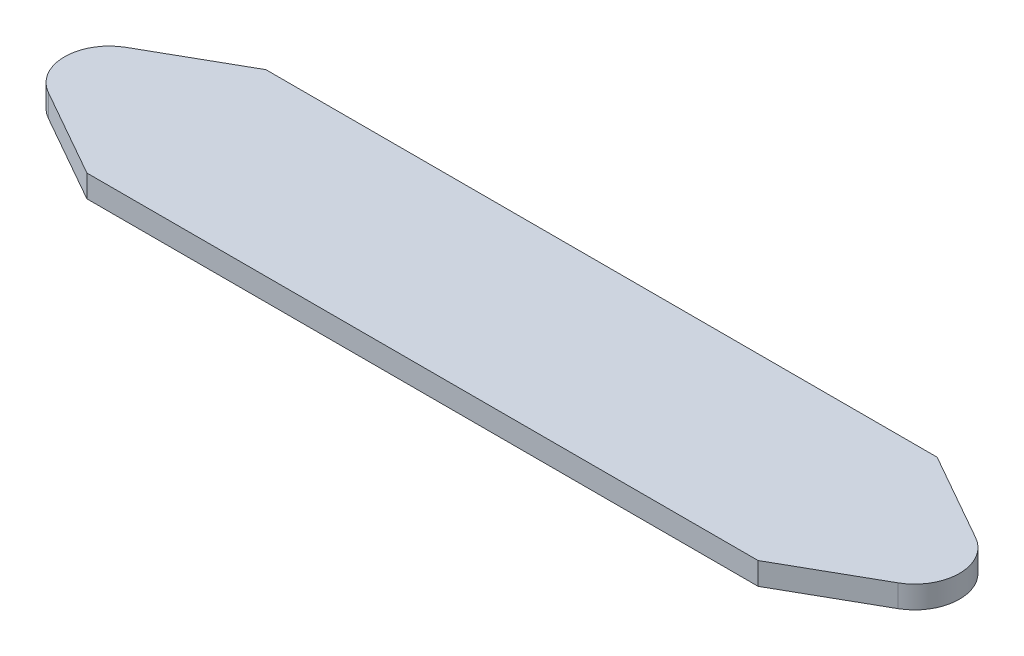
ISO-10303-21;
HEADER;
FILE_DESCRIPTION(('STEP AP214'),'2;1');
FILE_NAME('part.step','',(''),(''),'','','');
FILE_SCHEMA(('AUTOMOTIVE_DESIGN { 1 0 10303 214 1 1 1 1 }'));
ENDSEC;
DATA;
#1=APPLICATION_CONTEXT('core data for automotive mechanical design processes');
#2=APPLICATION_PROTOCOL_DEFINITION('international standard','automotive_design',2000,#1);
#3=PRODUCT_CONTEXT('',#1,'mechanical');
#4=PRODUCT('Part','Part','',(#3));
#5=PRODUCT_RELATED_PRODUCT_CATEGORY('part','',(#4));
#6=PRODUCT_DEFINITION_FORMATION('','',#4);
#7=PRODUCT_DEFINITION_CONTEXT('part definition',#1,'design');
#8=PRODUCT_DEFINITION('design','',#6,#7);
#9=PRODUCT_DEFINITION_SHAPE('','',#8);
#10=(LENGTH_UNIT() NAMED_UNIT(*) SI_UNIT(.MILLI.,.METRE.));
#11=(NAMED_UNIT(*) PLANE_ANGLE_UNIT() SI_UNIT($,.RADIAN.));
#12=(NAMED_UNIT(*) SI_UNIT($,.STERADIAN.) SOLID_ANGLE_UNIT());
#13=UNCERTAINTY_MEASURE_WITH_UNIT(LENGTH_MEASURE(1.E-05),#10,'distance_accuracy_value','');
#14=(GEOMETRIC_REPRESENTATION_CONTEXT(3) GLOBAL_UNCERTAINTY_ASSIGNED_CONTEXT((#13)) GLOBAL_UNIT_ASSIGNED_CONTEXT((#10,
#11,#12)) REPRESENTATION_CONTEXT('',''));
#15=CARTESIAN_POINT('',(0.,0.,0.));
#16=DIRECTION('',(0.,0.,1.));
#17=DIRECTION('',(1.,0.,0.));
#18=AXIS2_PLACEMENT_3D('',#15,#16,#17);
#19=CARTESIAN_POINT('',(180.,9.99999999999998,2.22044604925031E-13));
#20=DIRECTION('',(0.,-0.999999999999999,0.));
#21=DIRECTION('',(0.,0.,-0.999999999999996));
#22=AXIS2_PLACEMENT_3D('',#19,#20,#21);
#23=CYLINDRICAL_SURFACE('',#22,20.);
#24=CARTESIAN_POINT('',(180.,0.,2.22044604925031E-13));
#25=DIRECTION('',(0.,0.999999999999999,0.));
#26=DIRECTION('',(0.,0.,0.999999999999996));
#27=AXIS2_PLACEMENT_3D('',#24,#25,#26);
#28=CIRCLE('',#27,20.);
#29=CARTESIAN_POINT('',(189.864242223859,0.,17.3981816678941));
#30=VERTEX_POINT('',#29);
#31=CARTESIAN_POINT('',(189.864242223859,0.,-17.3981816678937));
#32=VERTEX_POINT('',#31);
#33=EDGE_CURVE('E128',#30,#32,#28,.T.);
#34=ORIENTED_EDGE('',*,*,#33,.T.);
#35=DIRECTION('',(0.,-0.999999999999999,0.));
#36=VECTOR('',#35,1.);
#37=CARTESIAN_POINT('',(189.864242223858,10.,-17.3981816678937));
#38=LINE('',#37,#36);
#39=CARTESIAN_POINT('',(189.864242223858,10.,-17.3981816678937));
#40=VERTEX_POINT('',#39);
#41=EDGE_CURVE('E11',#40,#32,#38,.T.);
#42=ORIENTED_EDGE('',*,*,#41,.F.);
#43=CARTESIAN_POINT('',(180.,9.99999999999998,2.22044604925031E-13));
#44=DIRECTION('',(0.,0.999999999999999,0.));
#45=DIRECTION('',(0.,0.,0.999999999999996));
#46=AXIS2_PLACEMENT_3D('',#43,#44,#45);
#47=CIRCLE('',#46,20.);
#48=CARTESIAN_POINT('',(189.864242223859,10.,17.3981816678941));
#49=VERTEX_POINT('',#48);
#50=EDGE_CURVE('E142',#49,#40,#47,.T.);
#51=ORIENTED_EDGE('',*,*,#50,.F.);
#52=DIRECTION('',(0.,-0.999999999999999,0.));
#53=VECTOR('',#52,1.);
#54=CARTESIAN_POINT('',(189.864242223859,10.,17.3981816678941));
#55=LINE('',#54,#53);
#56=EDGE_CURVE('E124',#49,#30,#55,.T.);
#57=ORIENTED_EDGE('',*,*,#56,.T.);
#58=EDGE_LOOP('',(#34,#42,#51,#57));
#59=FACE_BOUND('',#58,.T.);
#60=ADVANCED_FACE('F32',(#59),#23,.T.);
#61=CARTESIAN_POINT('',(150.,9.99999999999998,-39.9999999999996));
#62=DIRECTION('',(-0.493212111192936,0.,0.869909083394697));
#63=DIRECTION('',(0.869909083394701,0.,0.493212111192932));
#64=AXIS2_PLACEMENT_3D('',#61,#62,#63);
#65=PLANE('',#64);
#66=DIRECTION('',(-0.869909083394701,0.,-0.493212111192931));
#67=VECTOR('',#66,1.);
#68=CARTESIAN_POINT('',(150.,0.,-39.9999999999996));
#69=LINE('',#68,#67);
#70=CARTESIAN_POINT('',(150.,0.,-39.9999999999996));
#71=VERTEX_POINT('',#70);
#72=EDGE_CURVE('E131',#32,#71,#69,.T.);
#73=ORIENTED_EDGE('',*,*,#72,.T.);
#74=DIRECTION('',(0.,-0.999999999999999,0.));
#75=VECTOR('',#74,1.);
#76=CARTESIAN_POINT('',(150.,9.99999999999998,-39.9999999999996));
#77=LINE('',#76,#75);
#78=CARTESIAN_POINT('',(150.,9.99999999999998,-39.9999999999996));
#79=VERTEX_POINT('',#78);
#80=EDGE_CURVE('E40',#79,#71,#77,.T.);
#81=ORIENTED_EDGE('',*,*,#80,.F.);
#82=DIRECTION('',(-0.869909083394701,0.,-0.493212111192931));
#83=VECTOR('',#82,1.);
#84=CARTESIAN_POINT('',(150.,9.99999999999998,-39.9999999999996));
#85=LINE('',#84,#83);
#86=EDGE_CURVE('E91',#40,#79,#85,.T.);
#87=ORIENTED_EDGE('',*,*,#86,.F.);
#88=ORIENTED_EDGE('',*,*,#41,.T.);
#89=EDGE_LOOP('',(#73,#81,#87,#88));
#90=FACE_BOUND('',#89,.T.);
#91=ADVANCED_FACE('F177',(#90),#65,.F.);
#92=CARTESIAN_POINT('',(-150.,9.99999999999995,-39.9999999999993));
#93=DIRECTION('',(0.,0.,0.999999999999996));
#94=DIRECTION('',(1.,0.,0.));
#95=AXIS2_PLACEMENT_3D('',#92,#93,#94);
#96=PLANE('',#95);
#97=DIRECTION('',(-1.,0.,0.));
#98=VECTOR('',#97,1.);
#99=CARTESIAN_POINT('',(-150.,0.,-39.9999999999993));
#100=LINE('',#99,#98);
#101=CARTESIAN_POINT('',(-150.,0.,-39.9999999999993));
#102=VERTEX_POINT('',#101);
#103=EDGE_CURVE('E133',#71,#102,#100,.T.);
#104=ORIENTED_EDGE('',*,*,#103,.T.);
#105=DIRECTION('',(0.,-0.999999999999999,0.));
#106=VECTOR('',#105,1.);
#107=CARTESIAN_POINT('',(-150.,9.99999999999995,-39.9999999999993));
#108=LINE('',#107,#106);
#109=CARTESIAN_POINT('',(-150.,9.99999999999995,-39.9999999999993));
#110=VERTEX_POINT('',#109);
#111=EDGE_CURVE('E149',#110,#102,#108,.T.);
#112=ORIENTED_EDGE('',*,*,#111,.F.);
#113=DIRECTION('',(-1.,0.,0.));
#114=VECTOR('',#113,1.);
#115=CARTESIAN_POINT('',(-150.,9.99999999999995,-39.9999999999993));
#116=LINE('',#115,#114);
#117=EDGE_CURVE('E157',#79,#110,#116,.T.);
#118=ORIENTED_EDGE('',*,*,#117,.F.);
#119=ORIENTED_EDGE('',*,*,#80,.T.);
#120=EDGE_LOOP('',(#104,#112,#118,#119));
#121=FACE_BOUND('',#120,.T.);
#122=ADVANCED_FACE('F155',(#121),#96,.F.);
#123=CARTESIAN_POINT('',(-189.864242223859,9.99999999999993,-17.3981816678934));
#124=DIRECTION('',(0.493212111192934,0.,0.869909083394696));
#125=DIRECTION('',(0.869909083394702,0.,-0.493212111192933));
#126=AXIS2_PLACEMENT_3D('',#123,#124,#125);
#127=PLANE('',#126);
#128=DIRECTION('',(-0.869909083394702,0.,0.493212111192933));
#129=VECTOR('',#128,1.);
#130=CARTESIAN_POINT('',(-189.864242223859,0.,-17.3981816678934));
#131=LINE('',#130,#129);
#132=CARTESIAN_POINT('',(-189.864242223859,0.,-17.3981816678934));
#133=VERTEX_POINT('',#132);
#134=EDGE_CURVE('E135',#102,#133,#131,.T.);
#135=ORIENTED_EDGE('',*,*,#134,.T.);
#136=DIRECTION('',(0.,-0.999999999999999,0.));
#137=VECTOR('',#136,1.);
#138=CARTESIAN_POINT('',(-189.864242223859,9.99999999999993,-17.3981816678934));
#139=LINE('',#138,#137);
#140=CARTESIAN_POINT('',(-189.864242223859,9.99999999999993,-17.3981816678934));
#141=VERTEX_POINT('',#140);
#142=EDGE_CURVE('E146',#141,#133,#139,.T.);
#143=ORIENTED_EDGE('',*,*,#142,.F.);
#144=DIRECTION('',(-0.869909083394702,0.,0.493212111192933));
#145=VECTOR('',#144,1.);
#146=CARTESIAN_POINT('',(-189.864242223859,9.99999999999993,-17.3981816678934));
#147=LINE('',#146,#145);
#148=EDGE_CURVE('E169',#110,#141,#147,.T.);
#149=ORIENTED_EDGE('',*,*,#148,.F.);
#150=ORIENTED_EDGE('',*,*,#111,.T.);
#151=EDGE_LOOP('',(#135,#143,#149,#150));
#152=FACE_BOUND('',#151,.T.);
#153=ADVANCED_FACE('F165',(#152),#127,.F.);
#154=CARTESIAN_POINT('',(-180.,9.99999999999995,2.63677968348475E-13));
#155=DIRECTION('',(0.,-0.999999999999999,0.));
#156=DIRECTION('',(0.,0.,-0.999999999999996));
#157=AXIS2_PLACEMENT_3D('',#154,#155,#156);
#158=CYLINDRICAL_SURFACE('',#157,20.);
#159=CARTESIAN_POINT('',(-180.,-1.11022302462516E-13,2.63677968348475E-13));
#160=DIRECTION('',(0.,0.999999999999999,0.));
#161=DIRECTION('',(0.,0.,0.999999999999996));
#162=AXIS2_PLACEMENT_3D('',#159,#160,#161);
#163=CIRCLE('',#162,20.);
#164=CARTESIAN_POINT('',(-189.864242223859,0.,17.3981816678941));
#165=VERTEX_POINT('',#164);
#166=EDGE_CURVE('E137',#133,#165,#163,.T.);
#167=ORIENTED_EDGE('',*,*,#166,.T.);
#168=DIRECTION('',(0.,-0.999999999999999,0.));
#169=VECTOR('',#168,1.);
#170=CARTESIAN_POINT('',(-189.864242223859,9.99999999999998,17.3981816678943));
#171=LINE('',#170,#169);
#172=CARTESIAN_POINT('',(-189.864242223859,9.99999999999998,17.3981816678943));
#173=VERTEX_POINT('',#172);
#174=EDGE_CURVE('E119',#173,#165,#171,.T.);
#175=ORIENTED_EDGE('',*,*,#174,.F.);
#176=CARTESIAN_POINT('',(-180.,9.99999999999995,2.63677968348475E-13));
#177=DIRECTION('',(0.,0.999999999999999,0.));
#178=DIRECTION('',(0.,0.,0.999999999999996));
#179=AXIS2_PLACEMENT_3D('',#176,#177,#178);
#180=CIRCLE('',#179,20.);
#181=EDGE_CURVE('E110',#141,#173,#180,.T.);
#182=ORIENTED_EDGE('',*,*,#181,.F.);
#183=ORIENTED_EDGE('',*,*,#142,.T.);
#184=EDGE_LOOP('',(#167,#175,#182,#183));
#185=FACE_BOUND('',#184,.T.);
#186=ADVANCED_FACE('F168',(#185),#158,.T.);
#187=CARTESIAN_POINT('',(-189.864242223859,9.99999999999998,17.3981816678943));
#188=DIRECTION('',(0.493212111192936,0.,-0.869909083394697));
#189=DIRECTION('',(-0.869909083394701,0.,-0.493212111192931));
#190=AXIS2_PLACEMENT_3D('',#187,#188,#189);
#191=PLANE('',#190);
#192=DIRECTION('',(0.869909083394701,0.,0.493212111192931));
#193=VECTOR('',#192,1.);
#194=CARTESIAN_POINT('',(-189.864242223859,0.,17.3981816678941));
#195=LINE('',#194,#193);
#196=CARTESIAN_POINT('',(-150.,0.,40.));
#197=VERTEX_POINT('',#196);
#198=EDGE_CURVE('E118',#165,#197,#195,.T.);
#199=ORIENTED_EDGE('',*,*,#198,.T.);
#200=DIRECTION('',(0.,-0.999999999999999,0.));
#201=VECTOR('',#200,1.);
#202=CARTESIAN_POINT('',(-150.,9.99999999999998,40.));
#203=LINE('',#202,#201);
#204=CARTESIAN_POINT('',(-150.,9.99999999999998,40.));
#205=VERTEX_POINT('',#204);
#206=EDGE_CURVE('E115',#205,#197,#203,.T.);
#207=ORIENTED_EDGE('',*,*,#206,.F.);
#208=DIRECTION('',(0.869909083394701,0.,0.493212111192931));
#209=VECTOR('',#208,1.);
#210=CARTESIAN_POINT('',(-189.864242223859,9.99999999999998,17.3981816678943));
#211=LINE('',#210,#209);
#212=EDGE_CURVE('E104',#173,#205,#211,.T.);
#213=ORIENTED_EDGE('',*,*,#212,.F.);
#214=ORIENTED_EDGE('',*,*,#174,.T.);
#215=EDGE_LOOP('',(#199,#207,#213,#214));
#216=FACE_BOUND('',#215,.T.);
#217=ADVANCED_FACE('F116',(#216),#191,.F.);
#218=CARTESIAN_POINT('',(-150.,9.99999999999998,40.));
#219=DIRECTION('',(0.,0.,-0.999999999999996));
#220=DIRECTION('',(-1.,0.,0.));
#221=AXIS2_PLACEMENT_3D('',#218,#219,#220);
#222=PLANE('',#221);
#223=DIRECTION('',(1.,0.,0.));
#224=VECTOR('',#223,1.);
#225=CARTESIAN_POINT('',(-150.,0.,40.));
#226=LINE('',#225,#224);
#227=CARTESIAN_POINT('',(150.,0.,40.));
#228=VERTEX_POINT('',#227);
#229=EDGE_CURVE('E77',#197,#228,#226,.T.);
#230=ORIENTED_EDGE('',*,*,#229,.T.);
#231=DIRECTION('',(0.,-0.999999999999999,0.));
#232=VECTOR('',#231,1.);
#233=CARTESIAN_POINT('',(150.,10.,40.));
#234=LINE('',#233,#232);
#235=CARTESIAN_POINT('',(150.,10.,40.));
#236=VERTEX_POINT('',#235);
#237=EDGE_CURVE('E120',#236,#228,#234,.T.);
#238=ORIENTED_EDGE('',*,*,#237,.F.);
#239=DIRECTION('',(1.,0.,0.));
#240=VECTOR('',#239,1.);
#241=CARTESIAN_POINT('',(-150.,9.99999999999998,40.));
#242=LINE('',#241,#240);
#243=EDGE_CURVE('E108',#205,#236,#242,.T.);
#244=ORIENTED_EDGE('',*,*,#243,.F.);
#245=ORIENTED_EDGE('',*,*,#206,.T.);
#246=EDGE_LOOP('',(#230,#238,#244,#245));
#247=FACE_BOUND('',#246,.T.);
#248=ADVANCED_FACE('F122',(#247),#222,.F.);
#249=CARTESIAN_POINT('',(150.,10.,40.));
#250=DIRECTION('',(-0.493212111192934,0.,-0.869909083394696));
#251=DIRECTION('',(-0.869909083394702,0.,0.493212111192933));
#252=AXIS2_PLACEMENT_3D('',#249,#250,#251);
#253=PLANE('',#252);
#254=DIRECTION('',(0.869909083394702,0.,-0.493212111192933));
#255=VECTOR('',#254,1.);
#256=CARTESIAN_POINT('',(150.,0.,40.));
#257=LINE('',#256,#255);
#258=EDGE_CURVE('E83',#228,#30,#257,.T.);
#259=ORIENTED_EDGE('',*,*,#258,.T.);
#260=ORIENTED_EDGE('',*,*,#56,.F.);
#261=DIRECTION('',(0.869909083394702,0.,-0.493212111192933));
#262=VECTOR('',#261,1.);
#263=CARTESIAN_POINT('',(150.,10.,40.));
#264=LINE('',#263,#262);
#265=EDGE_CURVE('E48',#236,#49,#264,.T.);
#266=ORIENTED_EDGE('',*,*,#265,.F.);
#267=ORIENTED_EDGE('',*,*,#237,.T.);
#268=EDGE_LOOP('',(#259,#260,#266,#267));
#269=FACE_BOUND('',#268,.T.);
#270=ADVANCED_FACE('F193',(#269),#253,.F.);
#271=CARTESIAN_POINT('',(180.,9.99999999999998,2.22044604925031E-13));
#272=DIRECTION('',(0.,0.999999999999999,0.));
#273=DIRECTION('',(0.,0.,0.999999999999996));
#274=AXIS2_PLACEMENT_3D('',#271,#272,#273);
#275=PLANE('',#274);
#276=ORIENTED_EDGE('',*,*,#50,.T.);
#277=ORIENTED_EDGE('',*,*,#86,.T.);
#278=ORIENTED_EDGE('',*,*,#117,.T.);
#279=ORIENTED_EDGE('',*,*,#148,.T.);
#280=ORIENTED_EDGE('',*,*,#181,.T.);
#281=ORIENTED_EDGE('',*,*,#212,.T.);
#282=ORIENTED_EDGE('',*,*,#243,.T.);
#283=ORIENTED_EDGE('',*,*,#265,.T.);
#284=EDGE_LOOP('',(#276,#277,#278,#279,#280,#281,#282,#283));
#285=FACE_BOUND('',#284,.T.);
#286=ADVANCED_FACE('F106',(#285),#275,.T.);
#287=CARTESIAN_POINT('',(180.,0.,2.22044604925031E-13));
#288=DIRECTION('',(0.,0.999999999999999,0.));
#289=DIRECTION('',(0.,0.,0.999999999999996));
#290=AXIS2_PLACEMENT_3D('',#287,#288,#289);
#291=PLANE('',#290);
#292=ORIENTED_EDGE('',*,*,#33,.F.);
#293=ORIENTED_EDGE('',*,*,#258,.F.);
#294=ORIENTED_EDGE('',*,*,#229,.F.);
#295=ORIENTED_EDGE('',*,*,#198,.F.);
#296=ORIENTED_EDGE('',*,*,#166,.F.);
#297=ORIENTED_EDGE('',*,*,#134,.F.);
#298=ORIENTED_EDGE('',*,*,#103,.F.);
#299=ORIENTED_EDGE('',*,*,#72,.F.);
#300=EDGE_LOOP('',(#292,#293,#294,#295,#296,#297,#298,#299));
#301=FACE_BOUND('',#300,.T.);
#302=ADVANCED_FACE('F161',(#301),#291,.F.);
#303=CLOSED_SHELL('',(#60,#91,#122,#153,#186,#217,#248,#270,#286,#302));
#304=MANIFOLD_SOLID_BREP('B2',#303);
#305=ADVANCED_BREP_SHAPE_REPRESENTATION('',(#18,#304),#14);
#306=SHAPE_DEFINITION_REPRESENTATION(#9,#305);
ENDSEC;
END-ISO-10303-21;
